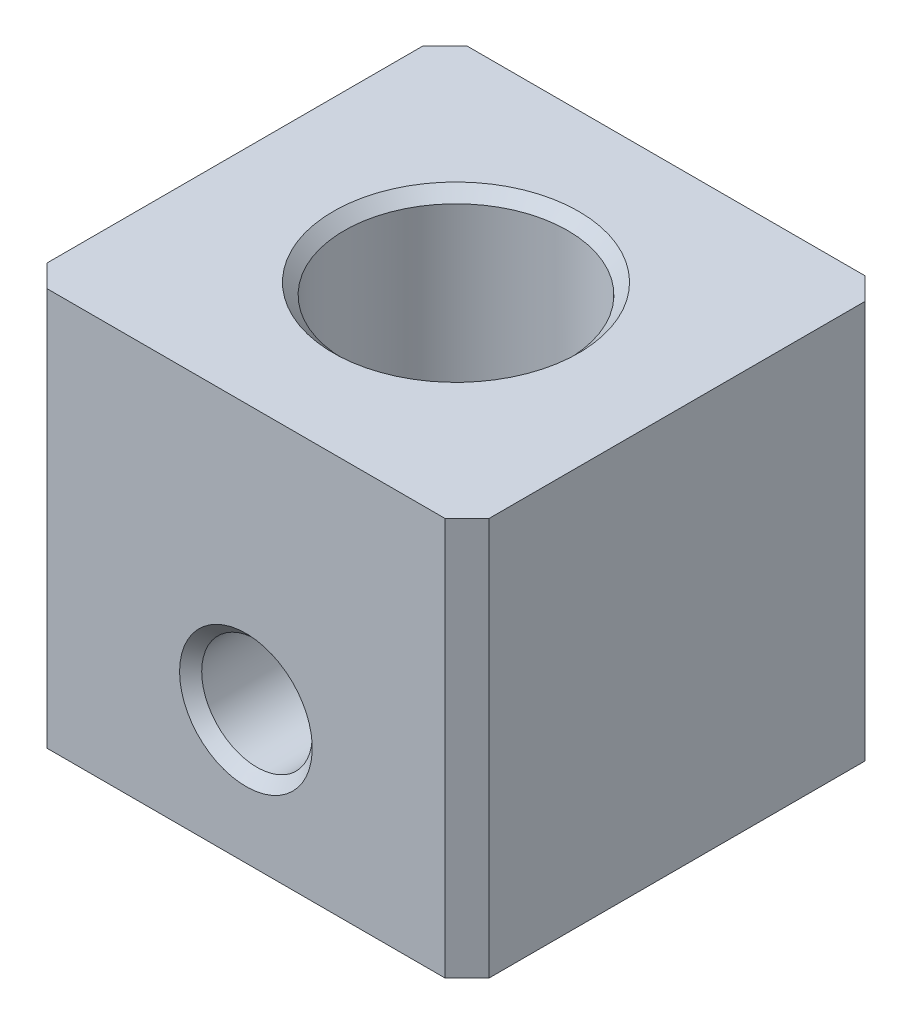
ISO-10303-21;
HEADER;
FILE_DESCRIPTION(('STEP AP214'),'2;1');
FILE_NAME('part.step','',(''),(''),'','','');
FILE_SCHEMA(('AUTOMOTIVE_DESIGN { 1 0 10303 214 1 1 1 1 }'));
ENDSEC;
DATA;
#1=APPLICATION_CONTEXT('core data for automotive mechanical design processes');
#2=APPLICATION_PROTOCOL_DEFINITION('international standard','automotive_design',2000,#1);
#3=PRODUCT_CONTEXT('',#1,'mechanical');
#4=PRODUCT('Part','Part','',(#3));
#5=PRODUCT_RELATED_PRODUCT_CATEGORY('part','',(#4));
#6=PRODUCT_DEFINITION_FORMATION('','',#4);
#7=PRODUCT_DEFINITION_CONTEXT('part definition',#1,'design');
#8=PRODUCT_DEFINITION('design','',#6,#7);
#9=PRODUCT_DEFINITION_SHAPE('','',#8);
#10=(LENGTH_UNIT() NAMED_UNIT(*) SI_UNIT(.MILLI.,.METRE.));
#11=(NAMED_UNIT(*) PLANE_ANGLE_UNIT() SI_UNIT($,.RADIAN.));
#12=(NAMED_UNIT(*) SI_UNIT($,.STERADIAN.) SOLID_ANGLE_UNIT());
#13=UNCERTAINTY_MEASURE_WITH_UNIT(LENGTH_MEASURE(1.E-05),#10,'distance_accuracy_value','');
#14=(GEOMETRIC_REPRESENTATION_CONTEXT(3) GLOBAL_UNCERTAINTY_ASSIGNED_CONTEXT((#13)) GLOBAL_UNIT_ASSIGNED_CONTEXT((#10,
#11,#12)) REPRESENTATION_CONTEXT('',''));
#15=CARTESIAN_POINT('',(0.,0.,0.));
#16=DIRECTION('',(0.,0.,1.));
#17=DIRECTION('',(1.,0.,0.));
#18=AXIS2_PLACEMENT_3D('',#15,#16,#17);
#19=CARTESIAN_POINT('',(0.,6.,9.5));
#20=DIRECTION('',(0.,0.,-1.));
#21=DIRECTION('',(-1.,0.,0.));
#22=AXIS2_PLACEMENT_3D('',#19,#20,#21);
#23=CYLINDRICAL_SURFACE('',#22,1.65);
#24=CARTESIAN_POINT('',(-1.65,6.,-4.77283982551269));
#25=CARTESIAN_POINT('',(-1.65000007150457,6.08998458375439,-4.77283983229566));
#26=CARTESIAN_POINT('',(-1.64261396260941,6.17996945562755,-4.77541243170647));
#27=CARTESIAN_POINT('',(-1.61335939653501,6.35728047304342,-4.78537401514265));
#28=CARTESIAN_POINT('',(-1.59148807358554,6.44460608889947,-4.79276395223071));
#29=CARTESIAN_POINT('',(-1.53410753704157,6.61400247680521,-4.81143576011074));
#30=CARTESIAN_POINT('',(-1.49862420390679,6.69608287816412,-4.82271024111675));
#31=CARTESIAN_POINT('',(-1.41511463700816,6.85315111603276,-4.84787019470639));
#32=CARTESIAN_POINT('',(-1.36708580826766,6.92813748079815,-4.86175620730644));
#33=CARTESIAN_POINT('',(-1.25791546850321,7.07170686281024,-4.8911598372264));
#34=CARTESIAN_POINT('',(-1.19638264980324,7.13998431507378,-4.90671694642023));
#35=CARTESIAN_POINT('',(-1.06278684702731,7.26545809435337,-4.93737535215243));
#36=CARTESIAN_POINT('',(-0.990722248546246,7.32265271936288,-4.95247657838002));
#37=CARTESIAN_POINT('',(-0.835886525655689,7.42571142100657,-4.98097718403292));
#38=CARTESIAN_POINT('',(-0.75289308787572,7.47125710500626,-4.99432468596331));
#39=CARTESIAN_POINT('',(-0.579912475846077,7.54762171543574,-5.01734996608446));
#40=CARTESIAN_POINT('',(-0.489927115003655,7.5784444456483,-5.02702869199676));
#41=CARTESIAN_POINT('',(-0.308719396646721,7.62345715991875,-5.04134622484732));
#42=CARTESIAN_POINT('',(-0.217639696635671,7.63817021517271,-5.04614314729866));
#43=CARTESIAN_POINT('',(-0.0341864492963193,7.65220720915571,-5.05071693870168));
#44=CARTESIAN_POINT('',(0.0581867716353401,7.65153496257029,-5.05049505203461));
#45=CARTESIAN_POINT('',(0.23790933078592,7.63515619675856,-5.04516432703224));
#46=CARTESIAN_POINT('',(0.325316776371484,7.62001745519118,-5.04024005193226));
#47=CARTESIAN_POINT('',(0.49627448158791,7.57607199992915,-5.02628803903677));
#48=CARTESIAN_POINT('',(0.579824482207439,7.54726436988601,-5.01726002613253));
#49=CARTESIAN_POINT('',(0.741959150213056,7.47645674219315,-4.99587581072242));
#50=CARTESIAN_POINT('',(0.820466077502682,7.4342917351125,-4.98347827096544));
#51=CARTESIAN_POINT('',(0.969460807721251,7.33810104876258,-4.95665058890783));
#52=CARTESIAN_POINT('',(1.03994643577259,7.28407216432531,-4.94221989770537));
#53=CARTESIAN_POINT('',(1.17427808072711,7.16280865719044,-4.9120796467874));
#54=CARTESIAN_POINT('',(1.23767811634085,7.09508632698695,-4.89634176866851));
#55=CARTESIAN_POINT('',(1.35236200233017,6.9498322982794,-4.86591679102978));
#56=CARTESIAN_POINT('',(1.40364413466184,6.87229921122231,-4.85122984071322));
#57=CARTESIAN_POINT('',(1.49322149768112,6.70826110408887,-4.82441846475725));
#58=CARTESIAN_POINT('',(1.53133604840777,6.62165101061215,-4.8123304888096));
#59=CARTESIAN_POINT('',(1.59229206757245,6.44274900799418,-4.79250930249929));
#60=CARTESIAN_POINT('',(1.61513963772528,6.35045938490111,-4.7847743525692));
#61=CARTESIAN_POINT('',(1.64402057979437,6.16712309449225,-4.77492621799161));
#62=CARTESIAN_POINT('',(1.6507426937523,6.07619724906568,-4.77258293685153));
#63=CARTESIAN_POINT('',(1.64912725179647,5.89450525044865,-4.77314167377812));
#64=CARTESIAN_POINT('',(1.64079229540001,5.80373907240049,-4.77604278643019));
#65=CARTESIAN_POINT('',(1.60991714237467,5.62802108493634,-4.78653474531972));
#66=CARTESIAN_POINT('',(1.58784820513241,5.54297618512192,-4.79396985114424));
#67=CARTESIAN_POINT('',(1.53069308227582,5.37781102774347,-4.81252275782798));
#68=CARTESIAN_POINT('',(1.49560464693938,5.29769162407807,-4.82364119511793));
#69=CARTESIAN_POINT('',(1.41217814485589,5.14192173642321,-4.84873186053699));
#70=CARTESIAN_POINT('',(1.36346571105808,5.06648453060419,-4.86278135287589));
#71=CARTESIAN_POINT('',(1.25460232846333,4.92460538110531,-4.89199797510853));
#72=CARTESIAN_POINT('',(1.19444813583303,4.85816599754975,-4.9071654212027));
#73=CARTESIAN_POINT('',(1.06112590733991,4.73301638622428,-4.93775176220491));
#74=CARTESIAN_POINT('',(0.987487038727308,4.67480132804583,-4.95315020851435));
#75=CARTESIAN_POINT('',(0.831108685419127,4.57152665220732,-4.98177352513979));
#76=CARTESIAN_POINT('',(0.748369558971143,4.52646651693569,-4.99499848096796));
#77=CARTESIAN_POINT('',(0.57658692660784,4.45120147282135,-5.01771797300493));
#78=CARTESIAN_POINT('',(0.487591134980506,4.42089568311047,-5.027237750361));
#79=CARTESIAN_POINT('',(0.30539579243949,4.37579794100281,-5.04158401506593));
#80=CARTESIAN_POINT('',(0.212197704637749,4.36100063186719,-5.04641212290862));
#81=CARTESIAN_POINT('',(0.0287815776524332,4.34780705637464,-5.05071353179807));
#82=CARTESIAN_POINT('',(-0.0613803496173528,4.34869858185265,-5.05041936934586));
#83=CARTESIAN_POINT('',(-0.240210366242467,4.36511167312163,-5.04507680669582));
#84=CARTESIAN_POINT('',(-0.328878568356423,4.38063212951798,-5.04002876701142));
#85=CARTESIAN_POINT('',(-0.500906907197568,4.42539578278083,-5.02582725458744));
#86=CARTESIAN_POINT('',(-0.584326056684733,4.45443314161155,-5.01673545053354));
#87=CARTESIAN_POINT('',(-0.745143456026018,4.5252174057367,-4.9953827478528));
#88=CARTESIAN_POINT('',(-0.822540629333119,4.56696657699386,-4.98312128427254));
#89=CARTESIAN_POINT('',(-0.972154265488818,4.66372300482302,-4.95614819551942));
#90=CARTESIAN_POINT('',(-1.04408373992136,4.71915361340504,-4.94136422972466));
#91=CARTESIAN_POINT('',(-1.17785400846834,4.84097084781343,-4.91119851546835));
#92=CARTESIAN_POINT('',(-1.23969163616386,4.90736089918339,-4.89581658125539));
#93=CARTESIAN_POINT('',(-1.35385439844273,5.0521660919642,-4.86551140668501));
#94=CARTESIAN_POINT('',(-1.40574041343588,5.13093653354214,-4.85062647969679));
#95=CARTESIAN_POINT('',(-1.49549447403618,5.29653806711125,-4.82371257420657));
#96=CARTESIAN_POINT('',(-1.53336685205839,5.38336665746774,-4.81168271345376));
#97=CARTESIAN_POINT('',(-1.59204020147218,5.55745391107752,-4.79257850468972));
#98=CARTESIAN_POINT('',(-1.61370631071606,5.64439354728338,-4.78525653181525));
#99=CARTESIAN_POINT('',(-1.64268394644884,5.82088924116449,-4.77538793001857));
#100=CARTESIAN_POINT('',(-1.64999992883638,5.91044447789339,-4.77283981876206));
#101=CARTESIAN_POINT('',(-1.65,6.,-4.77283982551269));
#102=B_SPLINE_CURVE_WITH_KNOTS('',3,(#24,#25,#26,#27,#28,#29,#30,#31,#32,#33,#34,#35,#36,#37,
#38,#39,#40,#41,#42,#43,#44,#45,#46,#47,#48,#49,#50,#51,#52,#53,#54,#55,#56,#57,#58,#59,#60,#61,
#62,#63,#64,#65,#66,#67,#68,#69,#70,#71,#72,#73,#74,#75,#76,#77,#78,#79,#80,#81,#82,#83,#84,#85,
#86,#87,#88,#89,#90,#91,#92,#93,#94,#95,#96,#97,#98,#99,#100,#101),.UNSPECIFIED.,.T.,.F.,(4,2,2,
2,2,2,2,2,2,2,2,2,2,2,2,2,2,2,2,2,2,2,2,2,2,2,2,2,2,2,2,2,2,2,2,2,2,2,4),(0.,0.269622380256899,
0.539298118834649,0.808463645093353,1.07768489112228,1.35608695418918,1.63453173805622,
1.91992551844298,2.20524552532575,2.48099820374598,2.75668251182394,3.021972970976,
3.28728121744585,3.55600388018154,3.82479923106726,4.10578264834983,4.38680587883963,
4.6715448364778,4.95616992505519,5.22840311480028,5.50058930952987,5.76391495939748,
6.02728613218968,6.29875879888013,6.57030854534746,6.85433079300938,7.13834186363714,
7.42038277851048,7.70232624231919,7.97150503672458,8.24066341942096,8.5058507490103,
8.77108537765745,9.04587279607376,9.32074626674819,9.60583882600319,9.89084317308923,
10.1592633095371,10.4276000848834),.UNSPECIFIED.);
#103=CARTESIAN_POINT('',(-1.65,6.,-4.77283982551269));
#104=VERTEX_POINT('',#103);
#105=EDGE_CURVE('E157',#104,#104,#102,.T.);
#106=ORIENTED_EDGE('',*,*,#105,.F.);
#107=EDGE_LOOP('',(#106));
#108=FACE_BOUND('',#107,.T.);
#109=CARTESIAN_POINT('',(0.,6.,-5.5));
#110=DIRECTION('',(0.,0.,-1.));
#111=DIRECTION('',(-1.,0.,0.));
#112=AXIS2_PLACEMENT_3D('',#109,#110,#111);
#113=CIRCLE('',#112,1.65);
#114=CARTESIAN_POINT('',(-1.65,6.,-5.5));
#115=VERTEX_POINT('',#114);
#116=EDGE_CURVE('E230',#115,#115,#113,.F.);
#117=ORIENTED_EDGE('',*,*,#116,.F.);
#118=EDGE_LOOP('',(#117));
#119=FACE_BOUND('',#118,.T.);
#120=ADVANCED_FACE('F51',(#108,#119),#23,.F.);
#121=CARTESIAN_POINT('',(-9.,12.,9.5));
#122=DIRECTION('',(0.707106781186549,0.,-0.707106781186546));
#123=DIRECTION('',(0.,-1.,0.));
#124=AXIS2_PLACEMENT_3D('',#121,#122,#123);
#125=PLANE('',#124);
#126=DIRECTION('',(-0.707106781186546,0.,-0.707106781186549));
#127=VECTOR('',#126,1.);
#128=CARTESIAN_POINT('',(-9.,0.,9.5));
#129=LINE('',#128,#127);
#130=CARTESIAN_POINT('',(-9.,0.,9.5));
#131=VERTEX_POINT('',#130);
#132=CARTESIAN_POINT('',(-10.,0.,8.5));
#133=VERTEX_POINT('',#132);
#134=EDGE_CURVE('E192',#131,#133,#129,.T.);
#135=ORIENTED_EDGE('',*,*,#134,.F.);
#136=DIRECTION('',(0.,-1.,0.));
#137=VECTOR('',#136,1.);
#138=CARTESIAN_POINT('',(-9.,12.,9.5));
#139=LINE('',#138,#137);
#140=CARTESIAN_POINT('',(-9.,18.,9.5));
#141=VERTEX_POINT('',#140);
#142=EDGE_CURVE('E177',#141,#131,#139,.T.);
#143=ORIENTED_EDGE('',*,*,#142,.F.);
#144=DIRECTION('',(-0.707106781186548,0.,-0.707106781186547));
#145=VECTOR('',#144,1.);
#146=CARTESIAN_POINT('',(-9.,18.,9.5));
#147=LINE('',#146,#145);
#148=CARTESIAN_POINT('',(-10.,18.,8.5));
#149=VERTEX_POINT('',#148);
#150=EDGE_CURVE('E167',#141,#149,#147,.T.);
#151=ORIENTED_EDGE('',*,*,#150,.T.);
#152=DIRECTION('',(0.,1.,0.));
#153=VECTOR('',#152,1.);
#154=CARTESIAN_POINT('',(-10.,12.,8.5));
#155=LINE('',#154,#153);
#156=EDGE_CURVE('E215',#133,#149,#155,.T.);
#157=ORIENTED_EDGE('',*,*,#156,.F.);
#158=EDGE_LOOP('',(#135,#143,#151,#157));
#159=FACE_BOUND('',#158,.T.);
#160=ADVANCED_FACE('F266',(#159),#125,.F.);
#161=CARTESIAN_POINT('',(-10.,12.,-8.5));
#162=DIRECTION('',(0.707106781186546,0.,0.707106781186549));
#163=DIRECTION('',(0.,-1.,0.));
#164=AXIS2_PLACEMENT_3D('',#161,#162,#163);
#165=PLANE('',#164);
#166=DIRECTION('',(0.707106781186549,0.,-0.707106781186546));
#167=VECTOR('',#166,1.);
#168=CARTESIAN_POINT('',(-10.,0.,-8.5));
#169=LINE('',#168,#167);
#170=CARTESIAN_POINT('',(-10.,0.,-8.5));
#171=VERTEX_POINT('',#170);
#172=CARTESIAN_POINT('',(-9.,0.,-9.5));
#173=VERTEX_POINT('',#172);
#174=EDGE_CURVE('E197',#171,#173,#169,.T.);
#175=ORIENTED_EDGE('',*,*,#174,.F.);
#176=DIRECTION('',(0.,-1.,0.));
#177=VECTOR('',#176,1.);
#178=CARTESIAN_POINT('',(-10.,12.,-8.5));
#179=LINE('',#178,#177);
#180=CARTESIAN_POINT('',(-10.,18.,-8.5));
#181=VERTEX_POINT('',#180);
#182=EDGE_CURVE('E212',#181,#171,#179,.T.);
#183=ORIENTED_EDGE('',*,*,#182,.F.);
#184=DIRECTION('',(0.707106781186548,0.,-0.707106781186547));
#185=VECTOR('',#184,1.);
#186=CARTESIAN_POINT('',(-10.,18.,-8.5));
#187=LINE('',#186,#185);
#188=CARTESIAN_POINT('',(-9.,18.,-9.5));
#189=VERTEX_POINT('',#188);
#190=EDGE_CURVE('E173',#181,#189,#187,.T.);
#191=ORIENTED_EDGE('',*,*,#190,.T.);
#192=DIRECTION('',(0.,1.,0.));
#193=VECTOR('',#192,1.);
#194=CARTESIAN_POINT('',(-9.,12.,-9.5));
#195=LINE('',#194,#193);
#196=EDGE_CURVE('E83',#173,#189,#195,.T.);
#197=ORIENTED_EDGE('',*,*,#196,.F.);
#198=EDGE_LOOP('',(#175,#183,#191,#197));
#199=FACE_BOUND('',#198,.T.);
#200=ADVANCED_FACE('F272',(#199),#165,.F.);
#201=CARTESIAN_POINT('',(9.,12.,-9.5));
#202=DIRECTION('',(-0.707106781186549,0.,0.707106781186546));
#203=DIRECTION('',(0.,1.,0.));
#204=AXIS2_PLACEMENT_3D('',#201,#202,#203);
#205=PLANE('',#204);
#206=DIRECTION('',(0.707106781186546,0.,0.707106781186549));
#207=VECTOR('',#206,1.);
#208=CARTESIAN_POINT('',(9.,0.,-9.5));
#209=LINE('',#208,#207);
#210=CARTESIAN_POINT('',(9.,0.,-9.5));
#211=VERTEX_POINT('',#210);
#212=CARTESIAN_POINT('',(10.,0.,-8.5));
#213=VERTEX_POINT('',#212);
#214=EDGE_CURVE('E209',#211,#213,#209,.T.);
#215=ORIENTED_EDGE('',*,*,#214,.F.);
#216=DIRECTION('',(0.,-1.,0.));
#217=VECTOR('',#216,1.);
#218=CARTESIAN_POINT('',(9.,12.,-9.5));
#219=LINE('',#218,#217);
#220=CARTESIAN_POINT('',(9.,18.,-9.5));
#221=VERTEX_POINT('',#220);
#222=EDGE_CURVE('E72',#221,#211,#219,.T.);
#223=ORIENTED_EDGE('',*,*,#222,.F.);
#224=DIRECTION('',(0.707106781186548,0.,0.707106781186547));
#225=VECTOR('',#224,1.);
#226=CARTESIAN_POINT('',(9.,18.,-9.5));
#227=LINE('',#226,#225);
#228=CARTESIAN_POINT('',(10.,18.,-8.5));
#229=VERTEX_POINT('',#228);
#230=EDGE_CURVE('E148',#221,#229,#227,.T.);
#231=ORIENTED_EDGE('',*,*,#230,.T.);
#232=DIRECTION('',(0.,1.,0.));
#233=VECTOR('',#232,1.);
#234=CARTESIAN_POINT('',(10.,12.,-8.5));
#235=LINE('',#234,#233);
#236=EDGE_CURVE('E131',#213,#229,#235,.T.);
#237=ORIENTED_EDGE('',*,*,#236,.F.);
#238=EDGE_LOOP('',(#215,#223,#231,#237));
#239=FACE_BOUND('',#238,.T.);
#240=ADVANCED_FACE('F153',(#239),#205,.F.);
#241=CARTESIAN_POINT('',(10.,12.,8.5));
#242=DIRECTION('',(-0.707106781186547,0.,-0.707106781186548));
#243=DIRECTION('',(-0.707106781186548,0.,0.707106781186547));
#244=AXIS2_PLACEMENT_3D('',#241,#242,#243);
#245=PLANE('',#244);
#246=DIRECTION('',(-0.707106781186548,0.,0.707106781186547));
#247=VECTOR('',#246,1.);
#248=CARTESIAN_POINT('',(10.,0.,8.5));
#249=LINE('',#248,#247);
#250=CARTESIAN_POINT('',(10.,0.,8.5));
#251=VERTEX_POINT('',#250);
#252=CARTESIAN_POINT('',(9.,0.,9.5));
#253=VERTEX_POINT('',#252);
#254=EDGE_CURVE('E181',#251,#253,#249,.T.);
#255=ORIENTED_EDGE('',*,*,#254,.F.);
#256=DIRECTION('',(0.,-1.,0.));
#257=VECTOR('',#256,1.);
#258=CARTESIAN_POINT('',(10.,12.,8.5));
#259=LINE('',#258,#257);
#260=CARTESIAN_POINT('',(10.,18.,8.5));
#261=VERTEX_POINT('',#260);
#262=EDGE_CURVE('E141',#261,#251,#259,.T.);
#263=ORIENTED_EDGE('',*,*,#262,.F.);
#264=DIRECTION('',(-0.707106781186548,0.,0.707106781186547));
#265=VECTOR('',#264,1.);
#266=CARTESIAN_POINT('',(10.,18.,8.5));
#267=LINE('',#266,#265);
#268=CARTESIAN_POINT('',(9.,18.,9.5));
#269=VERTEX_POINT('',#268);
#270=EDGE_CURVE('E151',#261,#269,#267,.T.);
#271=ORIENTED_EDGE('',*,*,#270,.T.);
#272=DIRECTION('',(0.,1.,0.));
#273=VECTOR('',#272,1.);
#274=CARTESIAN_POINT('',(9.,12.,9.5));
#275=LINE('',#274,#273);
#276=EDGE_CURVE('E180',#253,#269,#275,.T.);
#277=ORIENTED_EDGE('',*,*,#276,.F.);
#278=EDGE_LOOP('',(#255,#263,#271,#277));
#279=FACE_BOUND('',#278,.T.);
#280=ADVANCED_FACE('F344',(#279),#245,.F.);
#281=CARTESIAN_POINT('',(-10.,12.,-9.5));
#282=DIRECTION('',(0.,0.,1.));
#283=DIRECTION('',(1.,0.,0.));
#284=AXIS2_PLACEMENT_3D('',#281,#282,#283);
#285=PLANE('',#284);
#286=CARTESIAN_POINT('',(0.,6.,-9.5));
#287=DIRECTION('',(0.,0.,1.));
#288=DIRECTION('',(1.,0.,0.));
#289=AXIS2_PLACEMENT_3D('',#286,#287,#288);
#290=CIRCLE('',#289,3.);
#291=CARTESIAN_POINT('',(3.,6.,-9.5));
#292=VERTEX_POINT('',#291);
#293=EDGE_CURVE('E288',#292,#292,#290,.T.);
#294=ORIENTED_EDGE('',*,*,#293,.T.);
#295=EDGE_LOOP('',(#294));
#296=FACE_BOUND('',#295,.T.);
#297=ORIENTED_EDGE('',*,*,#196,.T.);
#298=DIRECTION('',(1.,0.,0.));
#299=VECTOR('',#298,1.);
#300=CARTESIAN_POINT('',(-9.,18.,-9.5));
#301=LINE('',#300,#299);
#302=EDGE_CURVE('E175',#189,#221,#301,.T.);
#303=ORIENTED_EDGE('',*,*,#302,.T.);
#304=ORIENTED_EDGE('',*,*,#222,.T.);
#305=DIRECTION('',(-1.,0.,0.));
#306=VECTOR('',#305,1.);
#307=CARTESIAN_POINT('',(-10.,0.,-9.5));
#308=LINE('',#307,#306);
#309=EDGE_CURVE('E206',#211,#173,#308,.T.);
#310=ORIENTED_EDGE('',*,*,#309,.T.);
#311=EDGE_LOOP('',(#297,#303,#304,#310));
#312=FACE_BOUND('',#311,.T.);
#313=ADVANCED_FACE('F343',(#296,#312),#285,.F.);
#314=CARTESIAN_POINT('',(10.,12.,-9.5));
#315=DIRECTION('',(-1.,0.,0.));
#316=DIRECTION('',(0.,0.,1.));
#317=AXIS2_PLACEMENT_3D('',#314,#315,#316);
#318=PLANE('',#317);
#319=ORIENTED_EDGE('',*,*,#236,.T.);
#320=DIRECTION('',(0.,0.,1.));
#321=VECTOR('',#320,1.);
#322=CARTESIAN_POINT('',(10.,18.,-8.5));
#323=LINE('',#322,#321);
#324=EDGE_CURVE('E134',#229,#261,#323,.T.);
#325=ORIENTED_EDGE('',*,*,#324,.T.);
#326=ORIENTED_EDGE('',*,*,#262,.T.);
#327=DIRECTION('',(0.,0.,-1.));
#328=VECTOR('',#327,1.);
#329=CARTESIAN_POINT('',(10.,0.,-9.5));
#330=LINE('',#329,#328);
#331=EDGE_CURVE('E136',#251,#213,#330,.T.);
#332=ORIENTED_EDGE('',*,*,#331,.T.);
#333=EDGE_LOOP('',(#319,#325,#326,#332));
#334=FACE_BOUND('',#333,.T.);
#335=ADVANCED_FACE('F133',(#334),#318,.F.);
#336=CARTESIAN_POINT('',(-10.,12.,9.5));
#337=DIRECTION('',(0.,0.,-1.));
#338=DIRECTION('',(0.,-1.,0.));
#339=AXIS2_PLACEMENT_3D('',#336,#337,#338);
#340=PLANE('',#339);
#341=CARTESIAN_POINT('',(0.,6.,9.5));
#342=DIRECTION('',(0.,0.,-1.));
#343=DIRECTION('',(-1.,0.,0.));
#344=AXIS2_PLACEMENT_3D('',#341,#342,#343);
#345=CIRCLE('',#344,3.);
#346=CARTESIAN_POINT('',(-3.,6.,9.5));
#347=VERTEX_POINT('',#346);
#348=EDGE_CURVE('E60',#347,#347,#345,.T.);
#349=ORIENTED_EDGE('',*,*,#348,.T.);
#350=EDGE_LOOP('',(#349));
#351=FACE_BOUND('',#350,.T.);
#352=ORIENTED_EDGE('',*,*,#276,.T.);
#353=DIRECTION('',(-1.,0.,0.));
#354=VECTOR('',#353,1.);
#355=CARTESIAN_POINT('',(9.,18.,9.5));
#356=LINE('',#355,#354);
#357=EDGE_CURVE('E164',#269,#141,#356,.T.);
#358=ORIENTED_EDGE('',*,*,#357,.T.);
#359=ORIENTED_EDGE('',*,*,#142,.T.);
#360=DIRECTION('',(1.,0.,0.));
#361=VECTOR('',#360,1.);
#362=CARTESIAN_POINT('',(-10.,0.,9.5));
#363=LINE('',#362,#361);
#364=EDGE_CURVE('E185',#131,#253,#363,.T.);
#365=ORIENTED_EDGE('',*,*,#364,.T.);
#366=EDGE_LOOP('',(#352,#358,#359,#365));
#367=FACE_BOUND('',#366,.T.);
#368=ADVANCED_FACE('F305',(#351,#367),#340,.F.);
#369=CARTESIAN_POINT('',(-10.,12.,-9.5));
#370=DIRECTION('',(1.,0.,0.));
#371=DIRECTION('',(0.,0.,-1.));
#372=AXIS2_PLACEMENT_3D('',#369,#370,#371);
#373=PLANE('',#372);
#374=ORIENTED_EDGE('',*,*,#156,.T.);
#375=DIRECTION('',(0.,0.,-1.));
#376=VECTOR('',#375,1.);
#377=CARTESIAN_POINT('',(-10.,18.,8.5));
#378=LINE('',#377,#376);
#379=EDGE_CURVE('E170',#149,#181,#378,.T.);
#380=ORIENTED_EDGE('',*,*,#379,.T.);
#381=ORIENTED_EDGE('',*,*,#182,.T.);
#382=DIRECTION('',(0.,0.,1.));
#383=VECTOR('',#382,1.);
#384=CARTESIAN_POINT('',(-10.,0.,-9.5));
#385=LINE('',#384,#383);
#386=EDGE_CURVE('E193',#171,#133,#385,.T.);
#387=ORIENTED_EDGE('',*,*,#386,.T.);
#388=EDGE_LOOP('',(#374,#380,#381,#387));
#389=FACE_BOUND('',#388,.T.);
#390=ADVANCED_FACE('F351',(#389),#373,.F.);
#391=CARTESIAN_POINT('',(0.,0.,0.));
#392=DIRECTION('',(0.,1.,0.));
#393=DIRECTION('',(1.,0.,0.));
#394=AXIS2_PLACEMENT_3D('',#391,#392,#393);
#395=PLANE('',#394);
#396=CARTESIAN_POINT('',(0.,0.,0.));
#397=DIRECTION('',(0.,1.,0.));
#398=DIRECTION('',(0.,0.,1.));
#399=AXIS2_PLACEMENT_3D('',#396,#397,#398);
#400=CIRCLE('',#399,5.55);
#401=CARTESIAN_POINT('',(0.,0.,5.55));
#402=VERTEX_POINT('',#401);
#403=EDGE_CURVE('E291',#402,#402,#400,.T.);
#404=ORIENTED_EDGE('',*,*,#403,.T.);
#405=EDGE_LOOP('',(#404));
#406=FACE_BOUND('',#405,.T.);
#407=ORIENTED_EDGE('',*,*,#331,.F.);
#408=ORIENTED_EDGE('',*,*,#254,.T.);
#409=ORIENTED_EDGE('',*,*,#364,.F.);
#410=ORIENTED_EDGE('',*,*,#134,.T.);
#411=ORIENTED_EDGE('',*,*,#386,.F.);
#412=ORIENTED_EDGE('',*,*,#174,.T.);
#413=ORIENTED_EDGE('',*,*,#309,.F.);
#414=ORIENTED_EDGE('',*,*,#214,.T.);
#415=EDGE_LOOP('',(#407,#408,#409,#410,#411,#412,#413,#414));
#416=FACE_BOUND('',#415,.T.);
#417=ADVANCED_FACE('F348',(#406,#416),#395,.F.);
#418=CARTESIAN_POINT('',(0.,18.,0.));
#419=DIRECTION('',(0.,-1.,0.));
#420=DIRECTION('',(0.,0.,-1.));
#421=AXIS2_PLACEMENT_3D('',#418,#419,#420);
#422=PLANE('',#421);
#423=CARTESIAN_POINT('',(0.,18.,0.));
#424=DIRECTION('',(0.,-1.,0.));
#425=DIRECTION('',(0.,0.,-1.));
#426=AXIS2_PLACEMENT_3D('',#423,#424,#425);
#427=CIRCLE('',#426,5.55);
#428=CARTESIAN_POINT('',(0.,18.,-5.55));
#429=VERTEX_POINT('',#428);
#430=EDGE_CURVE('E300',#429,#429,#427,.T.);
#431=ORIENTED_EDGE('',*,*,#430,.T.);
#432=EDGE_LOOP('',(#431));
#433=FACE_BOUND('',#432,.T.);
#434=ORIENTED_EDGE('',*,*,#230,.F.);
#435=ORIENTED_EDGE('',*,*,#302,.F.);
#436=ORIENTED_EDGE('',*,*,#190,.F.);
#437=ORIENTED_EDGE('',*,*,#379,.F.);
#438=ORIENTED_EDGE('',*,*,#150,.F.);
#439=ORIENTED_EDGE('',*,*,#357,.F.);
#440=ORIENTED_EDGE('',*,*,#270,.F.);
#441=ORIENTED_EDGE('',*,*,#324,.F.);
#442=EDGE_LOOP('',(#434,#435,#436,#437,#438,#439,#440,#441));
#443=FACE_BOUND('',#442,.T.);
#444=ADVANCED_FACE('F146',(#433,#443),#422,.F.);
#445=CARTESIAN_POINT('',(0.,0.,0.));
#446=DIRECTION('',(0.,1.,0.));
#447=DIRECTION('',(0.,0.,1.));
#448=AXIS2_PLACEMENT_3D('',#445,#446,#447);
#449=CYLINDRICAL_SURFACE('',#448,5.05);
#450=CARTESIAN_POINT('',(0.,0.500000000000003,0.));
#451=DIRECTION('',(0.,1.,0.));
#452=DIRECTION('',(0.,0.,1.));
#453=AXIS2_PLACEMENT_3D('',#450,#451,#452);
#454=CIRCLE('',#453,5.05);
#455=CARTESIAN_POINT('',(0.,0.500000000000003,5.05));
#456=VERTEX_POINT('',#455);
#457=EDGE_CURVE('E297',#456,#456,#454,.F.);
#458=ORIENTED_EDGE('',*,*,#457,.T.);
#459=EDGE_LOOP('',(#458));
#460=FACE_BOUND('',#459,.T.);
#461=CARTESIAN_POINT('',(0.,17.5,0.));
#462=DIRECTION('',(0.,-1.,0.));
#463=DIRECTION('',(0.,0.,-1.));
#464=AXIS2_PLACEMENT_3D('',#461,#462,#463);
#465=CIRCLE('',#464,5.05);
#466=CARTESIAN_POINT('',(0.,17.5,-5.05));
#467=VERTEX_POINT('',#466);
#468=EDGE_CURVE('E294',#467,#467,#465,.F.);
#469=ORIENTED_EDGE('',*,*,#468,.T.);
#470=EDGE_LOOP('',(#469));
#471=FACE_BOUND('',#470,.T.);
#472=CARTESIAN_POINT('',(0.,4.35,5.05));
#473=CARTESIAN_POINT('',(0.0901296857122161,4.34999992442669,5.05000000687402));
#474=CARTESIAN_POINT('',(0.180259672245083,4.35740900206142,5.04756470008344));
#475=CARTESIAN_POINT('',(0.35787096649063,4.3867630822702,5.03808924093926));
#476=CARTESIAN_POINT('',(0.445351893789525,4.40871016229556,5.03104843047025));
#477=CARTESIAN_POINT('',(0.615078683488259,4.46631191726427,5.01312833949185));
#478=CARTESIAN_POINT('',(0.697332835745129,4.50194422077649,5.00225532591545));
#479=CARTESIAN_POINT('',(0.854698009943489,4.58580574606307,4.97778476708667));
#480=CARTESIAN_POINT('',(0.929807707616804,4.63403729700203,4.96418671817794));
#481=CARTESIAN_POINT('',(1.07326301017718,4.74342292900643,4.93519269292951));
#482=CARTESIAN_POINT('',(1.14133659745569,4.80492260678185,4.9197548870062));
#483=CARTESIAN_POINT('',(1.26640986148721,4.93836363412983,4.88905528513336));
#484=CARTESIAN_POINT('',(1.32340722564552,5.01030715879766,4.87379352656494));
#485=CARTESIAN_POINT('',(1.4262375355836,5.16501209941581,4.84471748196128));
#486=CARTESIAN_POINT('',(1.47172134788597,5.24801612349498,4.83095438446009));
#487=CARTESIAN_POINT('',(1.54796888303672,5.42101771874155,4.80706776304677));
#488=CARTESIAN_POINT('',(1.57873689741836,5.51101324208409,4.7969431782582));
#489=CARTESIAN_POINT('',(1.62366707820816,5.6923573605058,4.78191943766365));
#490=CARTESIAN_POINT('',(1.63833733469979,5.78356647937844,4.77686086847093));
#491=CARTESIAN_POINT('',(1.65224362129443,5.96728100669613,4.77206980302483));
#492=CARTESIAN_POINT('',(1.65148420104578,6.05978602498837,4.77233573676959));
#493=CARTESIAN_POINT('',(1.63494812131053,6.23917599861492,4.77802360149601));
#494=CARTESIAN_POINT('',(1.61982888021176,6.32612994136875,4.78321980548445));
#495=CARTESIAN_POINT('',(1.57607268901176,6.4961918693709,4.7978142294033));
#496=CARTESIAN_POINT('',(1.54743417966855,6.57929940978086,4.80721293402166));
#497=CARTESIAN_POINT('',(1.47701120342212,6.74082636616845,4.8293180916877));
#498=CARTESIAN_POINT('',(1.43502821138492,6.81915217403852,4.84207396109863));
#499=CARTESIAN_POINT('',(1.3392458367141,6.96785748139006,4.86943485595468));
#500=CARTESIAN_POINT('',(1.28544314964336,7.03823475034765,4.88404039802897));
#501=CARTESIAN_POINT('',(1.16436906324498,7.17274679917344,4.91434868338057));
#502=CARTESIAN_POINT('',(1.09655847556613,7.23639308525692,4.93006976118991));
#503=CARTESIAN_POINT('',(0.951032079771356,7.35153522088821,4.9601968134105));
#504=CARTESIAN_POINT('',(0.873315395697116,7.4030299947746,4.97460267132829));
#505=CARTESIAN_POINT('',(0.709177518368579,7.49278022703625,5.00065254236986));
#506=CARTESIAN_POINT('',(0.622682788807577,7.5309094612936,5.01226991357642));
#507=CARTESIAN_POINT('',(0.444037286923524,7.59192711540509,5.03124084172477));
#508=CARTESIAN_POINT('',(0.351888410255823,7.61482061315082,5.03859581916654));
#509=CARTESIAN_POINT('',(0.168689384091071,7.64386229882882,5.04798010678348));
#510=CARTESIAN_POINT('',(0.0777545439722288,7.65067095639947,5.05021934287187));
#511=CARTESIAN_POINT('',(-0.10397349386336,7.64922488553374,5.04974662578468));
#512=CARTESIAN_POINT('',(-0.194766712068431,7.64097258762592,5.0470354715003));
#513=CARTESIAN_POINT('',(-0.371021799476238,7.6101640438127,5.03710499430397));
#514=CARTESIAN_POINT('',(-0.456561657973505,7.58800918464598,5.03001226039999));
#515=CARTESIAN_POINT('',(-0.622679327519041,7.5305223441357,5.01216075632003));
#516=CARTESIAN_POINT('',(-0.703256509610881,7.49518869653514,5.00140152258589));
#517=CARTESIAN_POINT('',(-0.859469738731827,7.41133703027046,4.97696963575805));
#518=CARTESIAN_POINT('',(-0.934925422625433,7.36250331615204,4.96322917374104));
#519=CARTESIAN_POINT('',(-1.07678822829059,7.25341109174157,4.93439721809237));
#520=CARTESIAN_POINT('',(-1.14319267412851,7.19314921533268,4.91930532709607));
#521=CARTESIAN_POINT('',(-1.26807568376858,7.0598043725575,4.88864006831517));
#522=CARTESIAN_POINT('',(-1.32608304000376,6.9862772894263,4.87307436115965));
#523=CARTESIAN_POINT('',(-1.42898900246531,6.83019677887399,4.84389934681145));
#524=CARTESIAN_POINT('',(-1.47388761351544,6.7476433547744,4.83029003889885));
#525=CARTESIAN_POINT('',(-1.54906754617432,6.57589062177301,4.80670856343838));
#526=CARTESIAN_POINT('',(-1.57938814694161,6.48670992754743,4.79672664016894));
#527=CARTESIAN_POINT('',(-1.62445396284741,6.30410973742489,4.78165504599856));
#528=CARTESIAN_POINT('',(-1.63920583424528,6.21069207083622,4.77656328444023));
#529=CARTESIAN_POINT('',(-1.65220919263602,6.02723329786729,4.77207994505414));
#530=CARTESIAN_POINT('',(-1.65123977951741,5.9372533546697,4.77241921052302));
#531=CARTESIAN_POINT('',(-1.63473369700952,5.75880863903548,4.77809796457043));
#532=CARTESIAN_POINT('',(-1.61919783119051,5.67034378329193,4.78343717732276));
#533=CARTESIAN_POINT('',(-1.57454197174674,5.4989767592839,4.79831770180621));
#534=CARTESIAN_POINT('',(-1.54566475686762,5.41600428425361,4.80778374889234));
#535=CARTESIAN_POINT('',(-1.47534066328954,5.25601745796524,4.82982623769735));
#536=CARTESIAN_POINT('',(-1.43389106574194,5.17900439999064,4.84240335209343));
#537=CARTESIAN_POINT('',(-1.33755592787856,5.02960087722826,4.86991281063862));
#538=CARTESIAN_POINT('',(-1.28217714556115,4.95754270132174,4.88492215550713));
#539=CARTESIAN_POINT('',(-1.16040042059306,4.82349023376615,4.91527247675599));
#540=CARTESIAN_POINT('',(-1.09399941818354,4.76149874610068,4.93061354419089));
#541=CARTESIAN_POINT('',(-0.949120188470464,4.64703965604898,4.96057793011154));
#542=CARTESIAN_POINT('',(-0.870286835627831,4.5950076736935,4.97515390391783));
#543=CARTESIAN_POINT('',(-0.704520009814064,4.50499518779654,5.0013175870808));
#544=CARTESIAN_POINT('',(-0.617588985578035,4.46701045352614,5.01290619584851));
#545=CARTESIAN_POINT('',(-0.443254910303117,4.4081471623006,5.03122827581436));
#546=CARTESIAN_POINT('',(-0.356167344176791,4.386409459589,5.03820291439096));
#547=CARTESIAN_POINT('',(-0.17938617885343,4.35733772064561,5.04758820125398));
#548=CARTESIAN_POINT('',(-0.0896932383838625,4.35000007520735,5.04999999315927));
#549=CARTESIAN_POINT('',(0.,4.35,5.05));
#550=B_SPLINE_CURVE_WITH_KNOTS('',3,(#472,#473,#474,#475,#476,#477,#478,#479,#480,#481,#482,
#483,#484,#485,#486,#487,#488,#489,#490,#491,#492,#493,#494,#495,#496,#497,#498,#499,#500,#501,
#502,#503,#504,#505,#506,#507,#508,#509,#510,#511,#512,#513,#514,#515,#516,#517,#518,#519,#520,
#521,#522,#523,#524,#525,#526,#527,#528,#529,#530,#531,#532,#533,#534,#535,#536,#537,#538,#539,
#540,#541,#542,#543,#544,#545,#546,#547,#548,#549),.UNSPECIFIED.,.T.,.F.,(4,2,2,2,2,2,2,2,2,2,2,
2,2,2,2,2,2,2,2,2,2,2,2,2,2,2,2,2,2,2,2,2,2,2,2,2,2,2,4),(0.,0.270059114976572,
0.540156829184988,0.809814877271601,1.07952281111664,1.35735775305635,1.63525064172583,
1.92076629538063,2.20619863393595,2.48233685583961,2.75839365584552,3.02239199380261,
3.28642078739496,3.5545774311548,3.82280913920191,4.10446103865753,4.38613786081615,
4.67040737839234,4.95458210477367,5.22686843797222,5.49911083364028,5.76383359349176,
6.02858983485481,6.3001548448363,6.57179996772833,6.8552770697776,7.13875406751277,
7.421462920602,7.70405085523495,7.97267930703238,8.24129294059374,8.50520015746087,
8.76916448649114,9.04426971242821,9.31945143544774,9.60478307826868,9.89002871521521,
10.1588474708269,10.4275988415426),.UNSPECIFIED.);
#551=CARTESIAN_POINT('',(0.,4.35,5.05));
#552=VERTEX_POINT('',#551);
#553=EDGE_CURVE('E154',#552,#552,#550,.T.);
#554=ORIENTED_EDGE('',*,*,#553,.T.);
#555=EDGE_LOOP('',(#554));
#556=FACE_BOUND('',#555,.T.);
#557=ORIENTED_EDGE('',*,*,#105,.T.);
#558=EDGE_LOOP('',(#557));
#559=FACE_BOUND('',#558,.T.);
#560=ADVANCED_FACE('F235',(#460,#471,#556,#559),#449,.F.);
#561=CARTESIAN_POINT('',(0.,6.,5.5));
#562=DIRECTION('',(0.,0.,-1.));
#563=DIRECTION('',(-1.,0.,0.));
#564=AXIS2_PLACEMENT_3D('',#561,#562,#563);
#565=CIRCLE('',#564,1.65);
#566=CARTESIAN_POINT('',(-1.65,6.,5.5));
#567=VERTEX_POINT('',#566);
#568=EDGE_CURVE('E281',#567,#567,#565,.F.);
#569=ORIENTED_EDGE('',*,*,#568,.T.);
#570=EDGE_LOOP('',(#569));
#571=FACE_BOUND('',#570,.T.);
#572=ORIENTED_EDGE('',*,*,#553,.F.);
#573=EDGE_LOOP('',(#572));
#574=FACE_BOUND('',#573,.T.);
#575=ADVANCED_FACE('F238',(#571,#574),#23,.F.);
#576=CARTESIAN_POINT('',(0.,6.,-5.5));
#577=DIRECTION('',(0.,0.,-1.));
#578=DIRECTION('',(-1.,0.,0.));
#579=AXIS2_PLACEMENT_3D('',#576,#577,#578);
#580=PLANE('',#579);
#581=CARTESIAN_POINT('',(0.,6.,-5.5));
#582=DIRECTION('',(0.,0.,-1.));
#583=DIRECTION('',(-1.,0.,0.));
#584=AXIS2_PLACEMENT_3D('',#581,#582,#583);
#585=CIRCLE('',#584,2.5);
#586=CARTESIAN_POINT('',(-2.5,6.,-5.5));
#587=VERTEX_POINT('',#586);
#588=EDGE_CURVE('E160',#587,#587,#585,.T.);
#589=ORIENTED_EDGE('',*,*,#588,.T.);
#590=EDGE_LOOP('',(#589));
#591=FACE_BOUND('',#590,.T.);
#592=ORIENTED_EDGE('',*,*,#116,.T.);
#593=EDGE_LOOP('',(#592));
#594=FACE_BOUND('',#593,.T.);
#595=ADVANCED_FACE('F242',(#591,#594),#580,.T.);
#596=CARTESIAN_POINT('',(0.,6.,-5.5));
#597=DIRECTION('',(0.,0.,-1.));
#598=DIRECTION('',(-1.,0.,0.));
#599=AXIS2_PLACEMENT_3D('',#596,#597,#598);
#600=CYLINDRICAL_SURFACE('',#599,2.5);
#601=CARTESIAN_POINT('',(0.,6.,-9.));
#602=DIRECTION('',(0.,0.,1.));
#603=DIRECTION('',(1.,0.,0.));
#604=AXIS2_PLACEMENT_3D('',#601,#602,#603);
#605=CIRCLE('',#604,2.5);
#606=CARTESIAN_POINT('',(2.5,6.,-9.));
#607=VERTEX_POINT('',#606);
#608=EDGE_CURVE('E188',#607,#607,#605,.F.);
#609=ORIENTED_EDGE('',*,*,#608,.T.);
#610=EDGE_LOOP('',(#609));
#611=FACE_BOUND('',#610,.T.);
#612=ORIENTED_EDGE('',*,*,#588,.F.);
#613=EDGE_LOOP('',(#612));
#614=FACE_BOUND('',#613,.T.);
#615=ADVANCED_FACE('F244',(#611,#614),#600,.F.);
#616=CARTESIAN_POINT('',(0.,6.,5.5));
#617=DIRECTION('',(0.,0.,-1.));
#618=DIRECTION('',(-1.,0.,0.));
#619=AXIS2_PLACEMENT_3D('',#616,#617,#618);
#620=PLANE('',#619);
#621=CARTESIAN_POINT('',(0.,6.,5.5));
#622=DIRECTION('',(0.,0.,-1.));
#623=DIRECTION('',(-1.,0.,0.));
#624=AXIS2_PLACEMENT_3D('',#621,#622,#623);
#625=CIRCLE('',#624,2.5);
#626=CARTESIAN_POINT('',(-2.5,6.,5.5));
#627=VERTEX_POINT('',#626);
#628=EDGE_CURVE('E285',#627,#627,#625,.T.);
#629=ORIENTED_EDGE('',*,*,#628,.F.);
#630=EDGE_LOOP('',(#629));
#631=FACE_BOUND('',#630,.T.);
#632=ORIENTED_EDGE('',*,*,#568,.F.);
#633=EDGE_LOOP('',(#632));
#634=FACE_BOUND('',#633,.T.);
#635=ADVANCED_FACE('F248',(#631,#634),#620,.F.);
#636=CARTESIAN_POINT('',(0.,6.,5.5));
#637=DIRECTION('',(0.,0.,1.));
#638=DIRECTION('',(1.,0.,0.));
#639=AXIS2_PLACEMENT_3D('',#636,#637,#638);
#640=CYLINDRICAL_SURFACE('',#639,2.5);
#641=CARTESIAN_POINT('',(0.,6.,9.));
#642=DIRECTION('',(0.,0.,-1.));
#643=DIRECTION('',(-1.,0.,0.));
#644=AXIS2_PLACEMENT_3D('',#641,#642,#643);
#645=CIRCLE('',#644,2.5);
#646=CARTESIAN_POINT('',(-2.5,6.,9.));
#647=VERTEX_POINT('',#646);
#648=EDGE_CURVE('E11',#647,#647,#645,.F.);
#649=ORIENTED_EDGE('',*,*,#648,.T.);
#650=EDGE_LOOP('',(#649));
#651=FACE_BOUND('',#650,.T.);
#652=ORIENTED_EDGE('',*,*,#628,.T.);
#653=EDGE_LOOP('',(#652));
#654=FACE_BOUND('',#653,.T.);
#655=ADVANCED_FACE('F253',(#651,#654),#640,.F.);
#656=CARTESIAN_POINT('',(0.,6.,-9.));
#657=DIRECTION('',(0.,0.,-1.));
#658=DIRECTION('',(-1.,0.,0.));
#659=AXIS2_PLACEMENT_3D('',#656,#657,#658);
#660=CONICAL_SURFACE('',#659,2.5,0.78539816339745);
#661=ORIENTED_EDGE('',*,*,#293,.F.);
#662=EDGE_LOOP('',(#661));
#663=FACE_BOUND('',#662,.T.);
#664=ORIENTED_EDGE('',*,*,#608,.F.);
#665=EDGE_LOOP('',(#664));
#666=FACE_BOUND('',#665,.T.);
#667=ADVANCED_FACE('F256',(#663,#666),#660,.F.);
#668=CARTESIAN_POINT('',(0.,0.,0.));
#669=DIRECTION('',(0.,-1.,0.));
#670=DIRECTION('',(0.,0.,-1.));
#671=AXIS2_PLACEMENT_3D('',#668,#669,#670);
#672=CONICAL_SURFACE('',#671,5.55,0.785398163397448);
#673=ORIENTED_EDGE('',*,*,#457,.F.);
#674=EDGE_LOOP('',(#673));
#675=FACE_BOUND('',#674,.T.);
#676=ORIENTED_EDGE('',*,*,#403,.F.);
#677=EDGE_LOOP('',(#676));
#678=FACE_BOUND('',#677,.T.);
#679=ADVANCED_FACE('F314',(#675,#678),#672,.F.);
#680=CARTESIAN_POINT('',(0.,17.5,0.));
#681=DIRECTION('',(0.,1.,0.));
#682=DIRECTION('',(0.,0.,1.));
#683=AXIS2_PLACEMENT_3D('',#680,#681,#682);
#684=CONICAL_SURFACE('',#683,5.05,0.785398163397454);
#685=ORIENTED_EDGE('',*,*,#430,.F.);
#686=EDGE_LOOP('',(#685));
#687=FACE_BOUND('',#686,.T.);
#688=ORIENTED_EDGE('',*,*,#468,.F.);
#689=EDGE_LOOP('',(#688));
#690=FACE_BOUND('',#689,.T.);
#691=ADVANCED_FACE('F309',(#687,#690),#684,.F.);
#692=CARTESIAN_POINT('',(0.,6.,9.5));
#693=DIRECTION('',(0.,0.,1.));
#694=DIRECTION('',(1.,0.,0.));
#695=AXIS2_PLACEMENT_3D('',#692,#693,#694);
#696=CONICAL_SURFACE('',#695,3.,0.785398163397447);
#697=ORIENTED_EDGE('',*,*,#648,.F.);
#698=EDGE_LOOP('',(#697));
#699=FACE_BOUND('',#698,.T.);
#700=ORIENTED_EDGE('',*,*,#348,.F.);
#701=EDGE_LOOP('',(#700));
#702=FACE_BOUND('',#701,.T.);
#703=ADVANCED_FACE('F54',(#699,#702),#696,.F.);
#704=CLOSED_SHELL('',(#120,#160,#200,#240,#280,#313,#335,#368,#390,#417,#444,#560,#575,#595,
#615,#635,#655,#667,#679,#691,#703));
#705=MANIFOLD_SOLID_BREP('B2',#704);
#706=ADVANCED_BREP_SHAPE_REPRESENTATION('',(#18,#705),#14);
#707=SHAPE_DEFINITION_REPRESENTATION(#9,#706);
ENDSEC;
END-ISO-10303-21;
